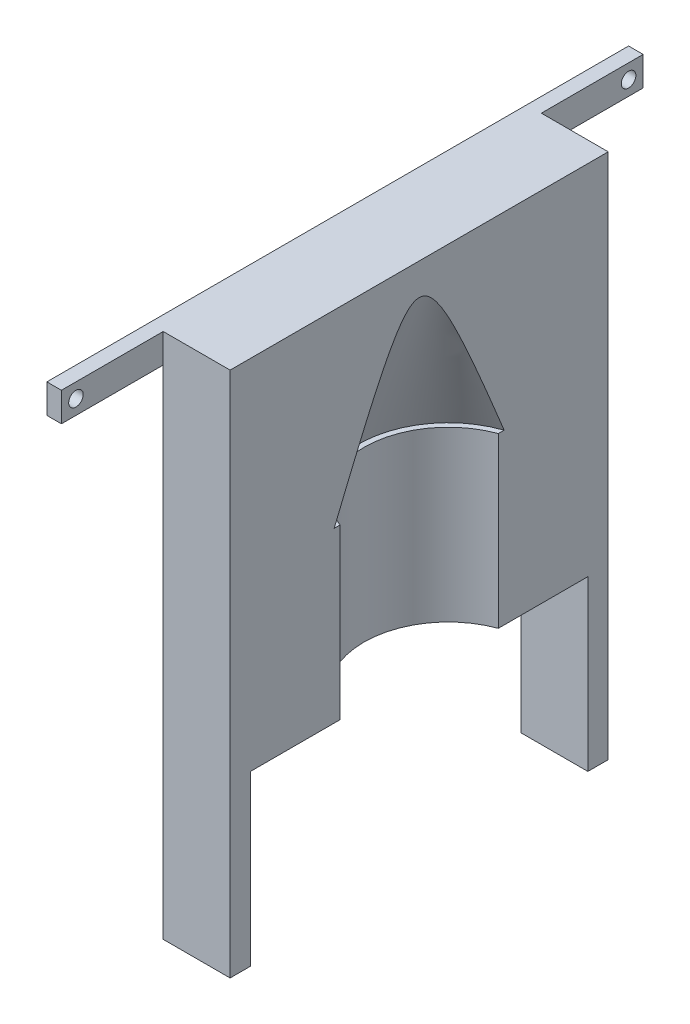
ISO-10303-21;
HEADER;
FILE_DESCRIPTION(('STEP AP214'),'2;1');
FILE_NAME('part.step','',(''),(''),'','','');
FILE_SCHEMA(('AUTOMOTIVE_DESIGN { 1 0 10303 214 1 1 1 1 }'));
ENDSEC;
DATA;
#1=APPLICATION_CONTEXT('core data for automotive mechanical design processes');
#2=APPLICATION_PROTOCOL_DEFINITION('international standard','automotive_design',2000,#1);
#3=PRODUCT_CONTEXT('',#1,'mechanical');
#4=PRODUCT('Part','Part','',(#3));
#5=PRODUCT_RELATED_PRODUCT_CATEGORY('part','',(#4));
#6=PRODUCT_DEFINITION_FORMATION('','',#4);
#7=PRODUCT_DEFINITION_CONTEXT('part definition',#1,'design');
#8=PRODUCT_DEFINITION('design','',#6,#7);
#9=PRODUCT_DEFINITION_SHAPE('','',#8);
#10=(LENGTH_UNIT() NAMED_UNIT(*) SI_UNIT(.MILLI.,.METRE.));
#11=(NAMED_UNIT(*) PLANE_ANGLE_UNIT() SI_UNIT($,.RADIAN.));
#12=(NAMED_UNIT(*) SI_UNIT($,.STERADIAN.) SOLID_ANGLE_UNIT());
#13=UNCERTAINTY_MEASURE_WITH_UNIT(LENGTH_MEASURE(1.E-05),#10,'distance_accuracy_value','');
#14=(GEOMETRIC_REPRESENTATION_CONTEXT(3) GLOBAL_UNCERTAINTY_ASSIGNED_CONTEXT((#13)) GLOBAL_UNIT_ASSIGNED_CONTEXT((#10,
#11,#12)) REPRESENTATION_CONTEXT('',''));
#15=CARTESIAN_POINT('',(0.,0.,0.));
#16=DIRECTION('',(0.,0.,1.));
#17=DIRECTION('',(1.,0.,0.));
#18=AXIS2_PLACEMENT_3D('',#15,#16,#17);
#19=CARTESIAN_POINT('',(0.,0.,0.));
#20=DIRECTION('',(-1.,0.,0.));
#21=DIRECTION('',(0.,0.,1.));
#22=AXIS2_PLACEMENT_3D('',#19,#20,#21);
#23=PLANE('',#22);
#24=DIRECTION('',(0.,-1.,0.));
#25=VECTOR('',#24,1.);
#26=CARTESIAN_POINT('',(0.,90.5,65.));
#27=LINE('',#26,#25);
#28=CARTESIAN_POINT('',(0.,80.5,65.));
#29=VERTEX_POINT('',#28);
#30=CARTESIAN_POINT('',(0.,-90.5,65.));
#31=VERTEX_POINT('',#30);
#32=EDGE_CURVE('E239',#29,#31,#27,.T.);
#33=ORIENTED_EDGE('',*,*,#32,.F.);
#34=DIRECTION('',(0.,0.,-1.));
#35=VECTOR('',#34,1.);
#36=CARTESIAN_POINT('',(0.,80.5,-100.));
#37=LINE('',#36,#35);
#38=CARTESIAN_POINT('',(0.,80.5,-65.));
#39=VERTEX_POINT('',#38);
#40=EDGE_CURVE('E11',#29,#39,#37,.T.);
#41=ORIENTED_EDGE('',*,*,#40,.T.);
#42=DIRECTION('',(0.,1.,0.));
#43=VECTOR('',#42,1.);
#44=CARTESIAN_POINT('',(0.,90.5,-65.));
#45=LINE('',#44,#43);
#46=CARTESIAN_POINT('',(0.,-90.5,-65.));
#47=VERTEX_POINT('',#46);
#48=EDGE_CURVE('E250',#47,#39,#45,.T.);
#49=ORIENTED_EDGE('',*,*,#48,.F.);
#50=DIRECTION('',(0.,0.,-1.));
#51=VECTOR('',#50,1.);
#52=CARTESIAN_POINT('',(0.,-90.5,-65.));
#53=LINE('',#52,#51);
#54=CARTESIAN_POINT('',(0.,-90.5,-58.));
#55=VERTEX_POINT('',#54);
#56=EDGE_CURVE('E268',#55,#47,#53,.T.);
#57=ORIENTED_EDGE('',*,*,#56,.F.);
#58=DIRECTION('',(0.,1.,0.));
#59=VECTOR('',#58,1.);
#60=CARTESIAN_POINT('',(0.,-32.5,-58.));
#61=LINE('',#60,#59);
#62=CARTESIAN_POINT('',(0.,-32.5,-58.));
#63=VERTEX_POINT('',#62);
#64=EDGE_CURVE('E221',#55,#63,#61,.T.);
#65=ORIENTED_EDGE('',*,*,#64,.T.);
#66=DIRECTION('',(0.,0.,1.));
#67=VECTOR('',#66,1.);
#68=CARTESIAN_POINT('',(0.,-32.5,-58.));
#69=LINE('',#68,#67);
#70=CARTESIAN_POINT('',(0.,-32.5,58.));
#71=VERTEX_POINT('',#70);
#72=EDGE_CURVE('E225',#63,#71,#69,.T.);
#73=ORIENTED_EDGE('',*,*,#72,.T.);
#74=DIRECTION('',(0.,-1.,0.));
#75=VECTOR('',#74,1.);
#76=CARTESIAN_POINT('',(0.,-32.5,58.));
#77=LINE('',#76,#75);
#78=CARTESIAN_POINT('',(0.,-90.5,58.));
#79=VERTEX_POINT('',#78);
#80=EDGE_CURVE('E218',#71,#79,#77,.T.);
#81=ORIENTED_EDGE('',*,*,#80,.T.);
#82=EDGE_CURVE('E262',#31,#79,#53,.T.);
#83=ORIENTED_EDGE('',*,*,#82,.F.);
#84=EDGE_LOOP('',(#33,#41,#49,#57,#65,#73,#81,#83));
#85=FACE_BOUND('',#84,.T.);
#86=ADVANCED_FACE('F33',(#85),#23,.T.);
#87=CARTESIAN_POINT('',(23.,0.,0.));
#88=DIRECTION('',(-1.,0.,0.));
#89=DIRECTION('',(0.,0.,1.));
#90=AXIS2_PLACEMENT_3D('',#87,#88,#89);
#91=PLANE('',#90);
#92=DIRECTION('',(0.,0.,-1.));
#93=VECTOR('',#92,1.);
#94=CARTESIAN_POINT('',(23.,25.5,0.));
#95=LINE('',#94,#93);
#96=CARTESIAN_POINT('',(23.,25.5,29.2193360843119));
#97=VERTEX_POINT('',#96);
#98=CARTESIAN_POINT('',(23.,25.5,27.2213151776324));
#99=VERTEX_POINT('',#98);
#100=EDGE_CURVE('E206',#97,#99,#95,.T.);
#101=ORIENTED_EDGE('',*,*,#100,.F.);
#102=CARTESIAN_POINT('',(23.,-2.71694901188246,-40.561504425211));
#103=CARTESIAN_POINT('',(23.,-1.15456543043743,-39.9402937218127));
#104=CARTESIAN_POINT('',(23.,0.407543859413401,-39.3183923668862));
#105=CARTESIAN_POINT('',(23.,3.53111515281802,-38.0729612876549));
#106=CARTESIAN_POINT('',(23.,5.09257715564489,-37.4494315615272));
#107=CARTESIAN_POINT('',(23.,8.21531728527836,-36.2002718070121));
#108=CARTESIAN_POINT('',(23.,9.77659514048049,-35.574641099497));
#109=CARTESIAN_POINT('',(23.,12.8982700185201,-34.3211883229983));
#110=CARTESIAN_POINT('',(23.,14.4586670418974,-33.6933662553592));
#111=CARTESIAN_POINT('',(23.,17.5698409111622,-32.4386023596454));
#112=CARTESIAN_POINT('',(23.,19.1206234633394,-31.8116746840084));
#113=CARTESIAN_POINT('',(23.,22.220959269952,-30.5547873347075));
#114=CARTESIAN_POINT('',(23.,23.7705125247416,-29.9248276619174));
#115=CARTESIAN_POINT('',(23.,26.8676055656516,-28.6614806305581));
#116=CARTESIAN_POINT('',(23.,28.4151458581239,-28.0280945138507));
#117=CARTESIAN_POINT('',(23.,31.508398754766,-26.7568947926566));
#118=CARTESIAN_POINT('',(23.,33.0541113681163,-26.1190812105204));
#119=CARTESIAN_POINT('',(23.,36.1426066265848,-24.8382570011151));
#120=CARTESIAN_POINT('',(23.,37.6853902441934,-24.1952487207926));
#121=CARTESIAN_POINT('',(23.,40.768106302081,-22.9023449721368));
#122=CARTESIAN_POINT('',(23.,42.3080386862585,-22.2524493699435));
#123=CARTESIAN_POINT('',(23.,45.385754569798,-20.943170700217));
#124=CARTESIAN_POINT('',(23.,46.9235341984788,-20.2837785139636));
#125=CARTESIAN_POINT('',(23.,49.2263621039367,-19.2859586068128));
#126=CARTESIAN_POINT('',(23.,49.9933069999857,-18.9519073825875));
#127=CARTESIAN_POINT('',(23.,51.5257034264248,-18.2803985921166));
#128=CARTESIAN_POINT('',(23.,52.2911549597671,-17.9429410326128));
#129=CARTESIAN_POINT('',(23.,53.8269946178615,-17.2610600098653));
#130=CARTESIAN_POINT('',(23.,54.5973671555537,-16.9166014095153));
#131=CARTESIAN_POINT('',(23.,56.135939904365,-16.2228684793397));
#132=CARTESIAN_POINT('',(23.,56.904140121607,-15.8735941631041));
#133=CARTESIAN_POINT('',(23.,58.4381041640188,-15.1691669180396));
#134=CARTESIAN_POINT('',(23.,59.2038672531584,-14.814012383253));
#135=CARTESIAN_POINT('',(23.,60.3500204827291,-14.2759929366525));
#136=CARTESIAN_POINT('',(23.,60.7316529530101,-14.0957734681745));
#137=CARTESIAN_POINT('',(23.,61.4939889403606,-13.7333651622926));
#138=CARTESIAN_POINT('',(23.,61.8746924428335,-13.5511762941848));
#139=CARTESIAN_POINT('',(23.,63.0135781579353,-13.0021254362194));
#140=CARTESIAN_POINT('',(23.,63.7701934368655,-12.6320032769823));
#141=CARTESIAN_POINT('',(23.,65.2779645582308,-11.8808002120246));
#142=CARTESIAN_POINT('',(23.,66.0291205398604,-11.4997195869459));
#143=CARTESIAN_POINT('',(23.,67.1501444488687,-10.9174956283988));
#144=CARTESIAN_POINT('',(23.,67.5227889825381,-10.7216964538518));
#145=CARTESIAN_POINT('',(23.,68.2658834930811,-10.3259810709359));
#146=CARTESIAN_POINT('',(23.,68.6363334972693,-10.1260649139492));
#147=CARTESIAN_POINT('',(23.,69.3745745748583,-9.72147651651361));
#148=CARTESIAN_POINT('',(23.,69.7423659540936,-9.51680483490947));
#149=CARTESIAN_POINT('',(23.,70.4747693145419,-9.10185915092699));
#150=CARTESIAN_POINT('',(23.,70.8393813830092,-8.89158530294295));
#151=CARTESIAN_POINT('',(23.,71.5119297087436,-8.4954550213924));
#152=CARTESIAN_POINT('',(23.,71.820394256708,-8.31049674268002));
#153=CARTESIAN_POINT('',(23.,72.433863826224,-7.93487717515019));
#154=CARTESIAN_POINT('',(23.,72.7388686528803,-7.74421556722791));
#155=CARTESIAN_POINT('',(23.,73.3452774902472,-7.35571218094492));
#156=CARTESIAN_POINT('',(23.,73.6466715651584,-7.15785484587998));
#157=CARTESIAN_POINT('',(23.,74.2439766870462,-6.75405717795531));
#158=CARTESIAN_POINT('',(23.,74.5398882297634,-6.5481175812113));
#159=CARTESIAN_POINT('',(23.,75.1205220332889,-6.12938054734126));
#160=CARTESIAN_POINT('',(23.,75.4053433443837,-5.91672124780829));
#161=CARTESIAN_POINT('',(23.,75.9659883264871,-5.47956579872521));
#162=CARTESIAN_POINT('',(23.,76.2418082336515,-5.25506479779258));
#163=CARTESIAN_POINT('',(23.,76.780034424738,-4.79220456885678));
#164=CARTESIAN_POINT('',(23.,77.0424854609127,-4.55389819124395));
#165=CARTESIAN_POINT('',(23.,77.4226573448818,-4.18281389138397));
#166=CARTESIAN_POINT('',(23.,77.547084608895,-4.05690011927531));
#167=CARTESIAN_POINT('',(23.,77.7904865498645,-3.79992477227676));
#168=CARTESIAN_POINT('',(23.,77.9094623374794,-3.66886425615597));
#169=CARTESIAN_POINT('',(23.,78.1224575209398,-3.42214829403843));
#170=CARTESIAN_POINT('',(23.,78.2174483985736,-3.30733376075375));
#171=CARTESIAN_POINT('',(23.,78.4017799637868,-3.0732107641221));
#172=CARTESIAN_POINT('',(23.,78.4911197726235,-2.95390160643978));
#173=CARTESIAN_POINT('',(23.,78.6631506456405,-2.71018350603859));
#174=CARTESIAN_POINT('',(23.,78.7458285771006,-2.58576518647259));
#175=CARTESIAN_POINT('',(23.,78.9028876860373,-2.33185528044668));
#176=CARTESIAN_POINT('',(23.,78.9772686440286,-2.20236355989915));
#177=CARTESIAN_POINT('',(23.,79.1877926361966,-1.80133618075302));
#178=CARTESIAN_POINT('',(23.,79.3085048497714,-1.52105716625192));
#179=CARTESIAN_POINT('',(23.,79.4458425888297,-1.08748685088425));
#180=CARTESIAN_POINT('',(23.,79.4843116637673,-0.940970508247966));
#181=CARTESIAN_POINT('',(23.,79.5449735118343,-0.644557975912634));
#182=CARTESIAN_POINT('',(23.,79.5671715254719,-0.494662890469897));
#183=CARTESIAN_POINT('',(23.,79.5921967927631,-0.213742779196021));
#184=CARTESIAN_POINT('',(23.,79.5972405295485,-0.0829118420919518));
#185=CARTESIAN_POINT('',(23.,79.5939977081466,0.178577569550754));
#186=CARTESIAN_POINT('',(23.,79.5857125168273,0.309236060398441));
#187=CARTESIAN_POINT('',(23.,79.5561648836452,0.569247369845229));
#188=CARTESIAN_POINT('',(23.,79.5348840023799,0.698598067251521));
#189=CARTESIAN_POINT('',(23.,79.4802309457021,0.954710031569805));
#190=CARTESIAN_POINT('',(23.,79.4468566760409,1.08147084596501));
#191=CARTESIAN_POINT('',(23.,79.3627813091392,1.35242704328258));
#192=CARTESIAN_POINT('',(23.,79.310120643362,1.4960117386883));
#193=CARTESIAN_POINT('',(23.,79.1921628754834,1.77790944926006));
#194=CARTESIAN_POINT('',(23.,79.1268591703966,1.91621966438529));
#195=CARTESIAN_POINT('',(23.,78.9856329108635,2.1874748901642));
#196=CARTESIAN_POINT('',(23.,78.909697479114,2.32041313877253));
#197=CARTESIAN_POINT('',(23.,78.7491112817668,2.58086427365188));
#198=CARTESIAN_POINT('',(23.,78.6644608542734,2.7083773701244));
#199=CARTESIAN_POINT('',(23.,78.4702495234878,2.98340804025333));
#200=CARTESIAN_POINT('',(23.,78.3591002026795,3.12979956968401));
#201=CARTESIAN_POINT('',(23.,78.1285338962478,3.41595136498936));
#202=CARTESIAN_POINT('',(23.,78.0091138688855,3.55570915896887));
#203=CARTESIAN_POINT('',(23.,77.7634843786121,3.82945482650925));
#204=CARTESIAN_POINT('',(23.,77.6372654762113,3.96343418740295));
#205=CARTESIAN_POINT('',(23.,77.3794300652796,4.22610068254962));
#206=CARTESIAN_POINT('',(23.,77.2478129192007,4.35478718808593));
#207=CARTESIAN_POINT('',(23.,76.9792580973167,4.60830766795903));
#208=CARTESIAN_POINT('',(23.,76.8422906344568,4.73310997859284));
#209=CARTESIAN_POINT('',(23.,76.564633297248,4.97849644747564));
#210=CARTESIAN_POINT('',(23.,76.4239433331556,5.09908050386639));
#211=CARTESIAN_POINT('',(23.,76.1395812101376,5.3363840920327));
#212=CARTESIAN_POINT('',(23.,75.9959120988749,5.45310728408698));
#213=CARTESIAN_POINT('',(23.,75.7059353166831,5.68320925032487));
#214=CARTESIAN_POINT('',(23.,75.5596277315765,5.79658813297491));
#215=CARTESIAN_POINT('',(23.,75.093758766028,6.15014694199077));
#216=CARTESIAN_POINT('',(23.,74.7700588568905,6.38488265091182));
#217=CARTESIAN_POINT('',(23.,74.11491298213,6.84332497142497));
#218=CARTESIAN_POINT('',(23.,73.7834654559411,7.06702933231018));
#219=CARTESIAN_POINT('',(23.,73.1144718529395,7.50558138067126));
#220=CARTESIAN_POINT('',(23.,72.7769219580433,7.72042322637696));
#221=CARTESIAN_POINT('',(23.,72.0972028064485,8.14267705532417));
#222=CARTESIAN_POINT('',(23.,71.755033349213,8.35008871458142));
#223=CARTESIAN_POINT('',(23.,71.0661118373121,8.75921468245548));
#224=CARTESIAN_POINT('',(23.,70.7193501936873,8.96091280660218));
#225=CARTESIAN_POINT('',(23.,70.0227967989378,9.35900885811934));
#226=CARTESIAN_POINT('',(23.,69.6730050009725,9.55540670336355));
#227=CARTESIAN_POINT('',(23.,68.9710522926589,9.94358616791139));
#228=CARTESIAN_POINT('',(23.,68.6188923661135,10.1353695688927));
#229=CARTESIAN_POINT('',(23.,67.9124615820975,10.5150121798831));
#230=CARTESIAN_POINT('',(23.,67.5581906986712,10.7028713415123));
#231=CARTESIAN_POINT('',(23.,66.4903682781551,11.2625631181371));
#232=CARTESIAN_POINT('',(23.,65.7741147213141,11.6292433523326));
#233=CARTESIAN_POINT('',(23.,64.3362311546349,12.352013494134));
#234=CARTESIAN_POINT('',(23.,63.614600679623,12.7081024718368));
#235=CARTESIAN_POINT('',(23.,62.1684374349543,13.4112409544957));
#236=CARTESIAN_POINT('',(23.,61.4439114849179,13.7583045034329));
#237=CARTESIAN_POINT('',(23.,60.3547134084548,14.2737618720948));
#238=CARTESIAN_POINT('',(23.,59.9912517112387,14.4447219662279));
#239=CARTESIAN_POINT('',(23.,59.2636005381594,14.7850865326695));
#240=CARTESIAN_POINT('',(23.,58.8994110624308,14.9544910052656));
#241=CARTESIAN_POINT('',(23.,57.8002160542382,15.4632031785868));
#242=CARTESIAN_POINT('',(23.,57.0642110358358,15.8003521368482));
#243=CARTESIAN_POINT('',(23.,55.5900310787856,16.4698761374476));
#244=CARTESIAN_POINT('',(23.,54.8518561274632,16.8022511518339));
#245=CARTESIAN_POINT('',(23.,53.3736888949931,17.4629733678655));
#246=CARTESIAN_POINT('',(23.,52.6336965772592,17.7913204876122));
#247=CARTESIAN_POINT('',(23.,51.1521914817615,18.4445680789479));
#248=CARTESIAN_POINT('',(23.,50.4106787004866,18.769468542567));
#249=CARTESIAN_POINT('',(23.,48.184084417211,19.739794340674));
#250=CARTESIAN_POINT('',(23.,46.6970715664036,20.3807886030345));
#251=CARTESIAN_POINT('',(23.,43.7192227414358,21.6538329113044));
#252=CARTESIAN_POINT('',(23.,42.2283867495994,22.2858829157726));
#253=CARTESIAN_POINT('',(23.,39.2421760433701,23.5436709468871));
#254=CARTESIAN_POINT('',(23.,37.746798177676,24.1694014862567));
#255=CARTESIAN_POINT('',(23.,34.7537225760922,25.4152946043202));
#256=CARTESIAN_POINT('',(23.,33.2560248346804,26.0354571697367));
#257=CARTESIAN_POINT('',(23.,30.2588501541198,27.2712392321964));
#258=CARTESIAN_POINT('',(23.,28.7593733135554,27.886858968465));
#259=CARTESIAN_POINT('',(23.,25.7589009331061,29.1143861179093));
#260=CARTESIAN_POINT('',(23.,24.2579053925725,29.7262935294989));
#261=CARTESIAN_POINT('',(23.,19.878421301271,31.5064464282132));
#262=CARTESIAN_POINT('',(23.,16.9982641846121,32.6705867403951));
#263=CARTESIAN_POINT('',(23.,11.2346237981118,34.9907314231739));
#264=CARTESIAN_POINT('',(23.,8.35114047415496,36.1467356591653));
#265=CARTESIAN_POINT('',(23.,2.58591599912343,38.4509365540143));
#266=CARTESIAN_POINT('',(23.,-0.295821594070801,39.5991421178015));
#267=CARTESIAN_POINT('',(23.,-4.6198033794067,41.3179037899596));
#268=CARTESIAN_POINT('',(23.,-6.06134546107743,41.8902275333845));
#269=CARTESIAN_POINT('',(23.,-8.94484592524028,43.0338243070685));
#270=CARTESIAN_POINT('',(23.,-10.386804307625,43.6050973375986));
#271=CARTESIAN_POINT('',(23.,-11.828945338117,44.1759089828929));
#272=B_SPLINE_CURVE_WITH_KNOTS('',3,(#102,#103,#104,#105,#106,#107,#108,#109,#110,#111,#112,
#113,#114,#115,#116,#117,#118,#119,#120,#121,#122,#123,#124,#125,#126,#127,#128,#129,#130,#131,
#132,#133,#134,#135,#136,#137,#138,#139,#140,#141,#142,#143,#144,#145,#146,#147,#148,#149,#150,
#151,#152,#153,#154,#155,#156,#157,#158,#159,#160,#161,#162,#163,#164,#165,#166,#167,#168,#169,
#170,#171,#172,#173,#174,#175,#176,#177,#178,#179,#180,#181,#182,#183,#184,#185,#186,#187,#188,
#189,#190,#191,#192,#193,#194,#195,#196,#197,#198,#199,#200,#201,#202,#203,#204,#205,#206,#207,
#208,#209,#210,#211,#212,#213,#214,#215,#216,#217,#218,#219,#220,#221,#222,#223,#224,#225,#226,
#227,#228,#229,#230,#231,#232,#233,#234,#235,#236,#237,#238,#239,#240,#241,#242,#243,#244,#245,
#246,#247,#248,#249,#250,#251,#252,#253,#254,#255,#256,#257,#258,#259,#260,#261,#262,#263,#264,
#265,#266,#267,#268,#269,#270,#271),.UNSPECIFIED.,.F.,.F.,(4,2,2,2,2,2,2,2,2,2,2,2,2,2,2,2,2,2,
2,2,2,2,2,2,2,2,2,2,2,2,2,2,2,2,2,2,2,2,2,2,2,2,2,2,2,2,2,2,2,2,2,2,2,2,2,2,2,2,2,2,2,2,2,2,2,2,
2,2,2,2,2,2,2,2,2,2,2,2,2,2,2,2,2,2,4),(0.,5.04405684692274,10.0881193431666,15.1340094055082,
20.1798963723327,25.1980291707885,30.2161605230357,35.2325809935415,40.2489761588142,
45.2632192639707,50.2775600038071,55.2970877399957,57.8066931717568,60.3162936373109,
62.8479056250019,65.379510469982,67.9118185207003,69.1779500971437,70.4441014417133,
72.9709130903674,75.4976600858972,76.760498052086,78.0233202669018,79.2859948244892,
80.5486346190047,81.6275830318934,82.7065919259531,83.788091258061,84.8694923169988,
85.935603025872,87.0021539503866,88.0648617601586,88.5958014984695,89.1266325801888,
89.573528733341,90.0204942089839,90.4683202738568,90.9161581825582,91.8259293632244,
92.2796363323282,92.7331971093017,93.1253239603836,93.5174106018207,93.9100548663008,
94.3027671586984,94.7608573005813,95.21918733431,95.6780773853861,96.1369496402095,
96.6879859909497,97.2392260850541,97.791252298161,98.3433438959374,98.8991419304518,
99.4549533765794,100.010221834878,100.565472264234,101.764694178034,102.964159763165,
104.164403744372,105.364699997216,106.568111573436,107.771541785469,108.974499633543,
110.17747230354,112.591313739925,115.005366487594,117.415405855909,118.620386856741,
119.825367634815,122.253997813207,124.682642205627,127.111335897765,129.540035204759,
134.397842959735,139.255673214846,144.118707575646,148.981753529729,153.844541541615,
158.707331631045,168.02690131841,177.346624830594,186.65280450768,191.305801349152,
195.958796990949),.UNSPECIFIED.);
#273=CARTESIAN_POINT('',(23.,25.5,-29.2193360843119));
#274=VERTEX_POINT('',#273);
#275=EDGE_CURVE('E42',#274,#97,#272,.T.);
#276=ORIENTED_EDGE('',*,*,#275,.F.);
#277=CARTESIAN_POINT('',(23.,25.5,-27.2213151776324));
#278=VERTEX_POINT('',#277);
#279=EDGE_CURVE('E202',#278,#274,#95,.T.);
#280=ORIENTED_EDGE('',*,*,#279,.F.);
#281=DIRECTION('',(0.,-1.,0.));
#282=VECTOR('',#281,1.);
#283=CARTESIAN_POINT('',(23.,25.5,-27.2213151776324));
#284=LINE('',#283,#282);
#285=CARTESIAN_POINT('',(23.,-32.5,-27.2213151776324));
#286=VERTEX_POINT('',#285);
#287=EDGE_CURVE('E214',#278,#286,#284,.T.);
#288=ORIENTED_EDGE('',*,*,#287,.T.);
#289=DIRECTION('',(0.,0.,1.));
#290=VECTOR('',#289,1.);
#291=CARTESIAN_POINT('',(23.,-32.5,-58.));
#292=LINE('',#291,#290);
#293=CARTESIAN_POINT('',(23.,-32.5,-58.));
#294=VERTEX_POINT('',#293);
#295=EDGE_CURVE('E222',#294,#286,#292,.T.);
#296=ORIENTED_EDGE('',*,*,#295,.F.);
#297=DIRECTION('',(0.,1.,0.));
#298=VECTOR('',#297,1.);
#299=CARTESIAN_POINT('',(23.,-32.5,-58.));
#300=LINE('',#299,#298);
#301=CARTESIAN_POINT('',(23.,-90.5,-58.));
#302=VERTEX_POINT('',#301);
#303=EDGE_CURVE('E230',#302,#294,#300,.T.);
#304=ORIENTED_EDGE('',*,*,#303,.F.);
#305=DIRECTION('',(0.,0.,-1.));
#306=VECTOR('',#305,1.);
#307=CARTESIAN_POINT('',(23.,-90.5,-65.));
#308=LINE('',#307,#306);
#309=CARTESIAN_POINT('',(23.,-90.5,-65.));
#310=VERTEX_POINT('',#309);
#311=EDGE_CURVE('E249',#302,#310,#308,.T.);
#312=ORIENTED_EDGE('',*,*,#311,.T.);
#313=DIRECTION('',(0.,1.,0.));
#314=VECTOR('',#313,1.);
#315=CARTESIAN_POINT('',(23.,90.5,-65.));
#316=LINE('',#315,#314);
#317=CARTESIAN_POINT('',(23.,90.5,-65.));
#318=VERTEX_POINT('',#317);
#319=EDGE_CURVE('E254',#310,#318,#316,.T.);
#320=ORIENTED_EDGE('',*,*,#319,.T.);
#321=DIRECTION('',(0.,0.,1.));
#322=VECTOR('',#321,1.);
#323=CARTESIAN_POINT('',(23.,90.5,-65.));
#324=LINE('',#323,#322);
#325=CARTESIAN_POINT('',(23.,90.5,65.));
#326=VERTEX_POINT('',#325);
#327=EDGE_CURVE('E256',#318,#326,#324,.T.);
#328=ORIENTED_EDGE('',*,*,#327,.T.);
#329=DIRECTION('',(0.,-1.,0.));
#330=VECTOR('',#329,1.);
#331=CARTESIAN_POINT('',(23.,90.5,65.));
#332=LINE('',#331,#330);
#333=CARTESIAN_POINT('',(23.,-90.5,65.));
#334=VERTEX_POINT('',#333);
#335=EDGE_CURVE('E246',#326,#334,#332,.T.);
#336=ORIENTED_EDGE('',*,*,#335,.T.);
#337=CARTESIAN_POINT('',(23.,-90.5,58.));
#338=VERTEX_POINT('',#337);
#339=EDGE_CURVE('E251',#334,#338,#308,.T.);
#340=ORIENTED_EDGE('',*,*,#339,.T.);
#341=DIRECTION('',(0.,-1.,0.));
#342=VECTOR('',#341,1.);
#343=CARTESIAN_POINT('',(23.,-32.5,58.));
#344=LINE('',#343,#342);
#345=CARTESIAN_POINT('',(23.,-32.5,58.));
#346=VERTEX_POINT('',#345);
#347=EDGE_CURVE('E217',#346,#338,#344,.T.);
#348=ORIENTED_EDGE('',*,*,#347,.F.);
#349=CARTESIAN_POINT('',(23.,-32.5,27.2213151776324));
#350=VERTEX_POINT('',#349);
#351=EDGE_CURVE('E233',#350,#346,#292,.T.);
#352=ORIENTED_EDGE('',*,*,#351,.F.);
#353=DIRECTION('',(0.,-1.,0.));
#354=VECTOR('',#353,1.);
#355=CARTESIAN_POINT('',(23.,25.5,27.2213151776324));
#356=LINE('',#355,#354);
#357=EDGE_CURVE('E59',#350,#99,#356,.F.);
#358=ORIENTED_EDGE('',*,*,#357,.T.);
#359=EDGE_LOOP('',(#101,#276,#280,#288,#296,#304,#312,#320,#328,#336,#340,#348,#352,#358));
#360=FACE_BOUND('',#359,.T.);
#361=ADVANCED_FACE('F297',(#360),#91,.F.);
#362=CARTESIAN_POINT('',(23.,-90.5,-65.));
#363=DIRECTION('',(0.,1.,0.));
#364=DIRECTION('',(0.,0.,1.));
#365=AXIS2_PLACEMENT_3D('',#362,#363,#364);
#366=PLANE('',#365);
#367=ORIENTED_EDGE('',*,*,#82,.T.);
#368=DIRECTION('',(1.,0.,0.));
#369=VECTOR('',#368,1.);
#370=CARTESIAN_POINT('',(0.,-90.5,58.));
#371=LINE('',#370,#369);
#372=EDGE_CURVE('E228',#79,#338,#371,.T.);
#373=ORIENTED_EDGE('',*,*,#372,.T.);
#374=ORIENTED_EDGE('',*,*,#339,.F.);
#375=DIRECTION('',(-1.,0.,0.));
#376=VECTOR('',#375,1.);
#377=CARTESIAN_POINT('',(23.,-90.5,65.));
#378=LINE('',#377,#376);
#379=EDGE_CURVE('E287',#334,#31,#378,.T.);
#380=ORIENTED_EDGE('',*,*,#379,.T.);
#381=EDGE_LOOP('',(#367,#373,#374,#380));
#382=FACE_BOUND('',#381,.T.);
#383=ADVANCED_FACE('F332',(#382),#366,.F.);
#384=CARTESIAN_POINT('',(23.,90.5,65.));
#385=DIRECTION('',(0.,0.,-1.));
#386=DIRECTION('',(0.,1.,0.));
#387=AXIS2_PLACEMENT_3D('',#384,#385,#386);
#388=PLANE('',#387);
#389=CARTESIAN_POINT('',(0.,90.5,65.));
#390=VERTEX_POINT('',#389);
#391=EDGE_CURVE('E261',#390,#29,#27,.T.);
#392=ORIENTED_EDGE('',*,*,#391,.T.);
#393=ORIENTED_EDGE('',*,*,#32,.T.);
#394=ORIENTED_EDGE('',*,*,#379,.F.);
#395=ORIENTED_EDGE('',*,*,#335,.F.);
#396=DIRECTION('',(-1.,0.,0.));
#397=VECTOR('',#396,1.);
#398=CARTESIAN_POINT('',(23.,90.5,65.));
#399=LINE('',#398,#397);
#400=EDGE_CURVE('E258',#326,#390,#399,.T.);
#401=ORIENTED_EDGE('',*,*,#400,.T.);
#402=EDGE_LOOP('',(#392,#393,#394,#395,#401));
#403=FACE_BOUND('',#402,.T.);
#404=ADVANCED_FACE('F35',(#403),#388,.F.);
#405=ORIENTED_EDGE('',*,*,#311,.F.);
#406=DIRECTION('',(1.,0.,0.));
#407=VECTOR('',#406,1.);
#408=CARTESIAN_POINT('',(0.,-90.5,-58.));
#409=LINE('',#408,#407);
#410=EDGE_CURVE('E242',#55,#302,#409,.T.);
#411=ORIENTED_EDGE('',*,*,#410,.F.);
#412=ORIENTED_EDGE('',*,*,#56,.T.);
#413=DIRECTION('',(-1.,0.,0.));
#414=VECTOR('',#413,1.);
#415=CARTESIAN_POINT('',(23.,-90.5,-65.));
#416=LINE('',#415,#414);
#417=EDGE_CURVE('E285',#310,#47,#416,.T.);
#418=ORIENTED_EDGE('',*,*,#417,.F.);
#419=EDGE_LOOP('',(#405,#411,#412,#418));
#420=FACE_BOUND('',#419,.T.);
#421=ADVANCED_FACE('F313',(#420),#366,.F.);
#422=CARTESIAN_POINT('',(23.,90.5,-65.));
#423=DIRECTION('',(0.,0.,1.));
#424=DIRECTION('',(0.,-1.,0.));
#425=AXIS2_PLACEMENT_3D('',#422,#423,#424);
#426=PLANE('',#425);
#427=ORIENTED_EDGE('',*,*,#48,.T.);
#428=CARTESIAN_POINT('',(0.,90.5,-65.));
#429=VERTEX_POINT('',#428);
#430=EDGE_CURVE('E280',#39,#429,#45,.T.);
#431=ORIENTED_EDGE('',*,*,#430,.T.);
#432=DIRECTION('',(-1.,0.,0.));
#433=VECTOR('',#432,1.);
#434=CARTESIAN_POINT('',(23.,90.5,-65.));
#435=LINE('',#434,#433);
#436=EDGE_CURVE('E277',#318,#429,#435,.T.);
#437=ORIENTED_EDGE('',*,*,#436,.F.);
#438=ORIENTED_EDGE('',*,*,#319,.F.);
#439=ORIENTED_EDGE('',*,*,#417,.T.);
#440=EDGE_LOOP('',(#427,#431,#437,#438,#439));
#441=FACE_BOUND('',#440,.T.);
#442=ADVANCED_FACE('F319',(#441),#426,.F.);
#443=CARTESIAN_POINT('',(23.,90.5,-65.));
#444=DIRECTION('',(0.,-1.,0.));
#445=DIRECTION('',(0.,0.,-1.));
#446=AXIS2_PLACEMENT_3D('',#443,#444,#445);
#447=PLANE('',#446);
#448=ORIENTED_EDGE('',*,*,#436,.T.);
#449=DIRECTION('',(0.,0.,-1.));
#450=VECTOR('',#449,1.);
#451=CARTESIAN_POINT('',(0.,90.5,-100.));
#452=LINE('',#451,#450);
#453=CARTESIAN_POINT('',(0.,90.5,-100.));
#454=VERTEX_POINT('',#453);
#455=EDGE_CURVE('E186',#429,#454,#452,.T.);
#456=ORIENTED_EDGE('',*,*,#455,.T.);
#457=DIRECTION('',(-1.,0.,0.));
#458=VECTOR('',#457,1.);
#459=CARTESIAN_POINT('',(-5.,90.5,-100.));
#460=LINE('',#459,#458);
#461=CARTESIAN_POINT('',(-5.,90.5,-100.));
#462=VERTEX_POINT('',#461);
#463=EDGE_CURVE('E172',#454,#462,#460,.T.);
#464=ORIENTED_EDGE('',*,*,#463,.T.);
#465=DIRECTION('',(0.,0.,1.));
#466=VECTOR('',#465,1.);
#467=CARTESIAN_POINT('',(-5.,90.5,-100.));
#468=LINE('',#467,#466);
#469=CARTESIAN_POINT('',(-5.,90.5,100.));
#470=VERTEX_POINT('',#469);
#471=EDGE_CURVE('E182',#462,#470,#468,.T.);
#472=ORIENTED_EDGE('',*,*,#471,.T.);
#473=DIRECTION('',(1.,0.,0.));
#474=VECTOR('',#473,1.);
#475=CARTESIAN_POINT('',(-5.,90.5,100.));
#476=LINE('',#475,#474);
#477=CARTESIAN_POINT('',(0.,90.5,100.));
#478=VERTEX_POINT('',#477);
#479=EDGE_CURVE('E155',#470,#478,#476,.T.);
#480=ORIENTED_EDGE('',*,*,#479,.T.);
#481=EDGE_CURVE('E175',#478,#390,#452,.T.);
#482=ORIENTED_EDGE('',*,*,#481,.T.);
#483=ORIENTED_EDGE('',*,*,#400,.F.);
#484=ORIENTED_EDGE('',*,*,#327,.F.);
#485=EDGE_LOOP('',(#448,#456,#464,#472,#480,#482,#483,#484));
#486=FACE_BOUND('',#485,.T.);
#487=ADVANCED_FACE('F325',(#486),#447,.F.);
#488=CARTESIAN_POINT('',(0.,-32.5,58.));
#489=DIRECTION('',(0.,0.,1.));
#490=DIRECTION('',(1.,0.,0.));
#491=AXIS2_PLACEMENT_3D('',#488,#489,#490);
#492=PLANE('',#491);
#493=ORIENTED_EDGE('',*,*,#347,.T.);
#494=ORIENTED_EDGE('',*,*,#372,.F.);
#495=ORIENTED_EDGE('',*,*,#80,.F.);
#496=DIRECTION('',(1.,0.,0.));
#497=VECTOR('',#496,1.);
#498=CARTESIAN_POINT('',(0.,-32.5,58.));
#499=LINE('',#498,#497);
#500=EDGE_CURVE('E236',#71,#346,#499,.T.);
#501=ORIENTED_EDGE('',*,*,#500,.T.);
#502=EDGE_LOOP('',(#493,#494,#495,#501));
#503=FACE_BOUND('',#502,.T.);
#504=ADVANCED_FACE('F335',(#503),#492,.F.);
#505=CARTESIAN_POINT('',(0.,-32.5,-58.));
#506=DIRECTION('',(0.,1.,0.));
#507=DIRECTION('',(0.,0.,1.));
#508=AXIS2_PLACEMENT_3D('',#505,#506,#507);
#509=PLANE('',#508);
#510=ORIENTED_EDGE('',*,*,#295,.T.);
#511=CARTESIAN_POINT('',(33.,-32.5,0.));
#512=DIRECTION('',(0.,-1.,0.));
#513=DIRECTION('',(0.,0.,-1.));
#514=AXIS2_PLACEMENT_3D('',#511,#512,#513);
#515=CIRCLE('',#514,29.);
#516=EDGE_CURVE('E211',#350,#286,#515,.T.);
#517=ORIENTED_EDGE('',*,*,#516,.F.);
#518=ORIENTED_EDGE('',*,*,#351,.T.);
#519=ORIENTED_EDGE('',*,*,#500,.F.);
#520=ORIENTED_EDGE('',*,*,#72,.F.);
#521=DIRECTION('',(1.,0.,0.));
#522=VECTOR('',#521,1.);
#523=CARTESIAN_POINT('',(0.,-32.5,-58.));
#524=LINE('',#523,#522);
#525=EDGE_CURVE('E240',#63,#294,#524,.T.);
#526=ORIENTED_EDGE('',*,*,#525,.T.);
#527=EDGE_LOOP('',(#510,#517,#518,#519,#520,#526));
#528=FACE_BOUND('',#527,.T.);
#529=ADVANCED_FACE('F305',(#528),#509,.F.);
#530=CARTESIAN_POINT('',(0.,-32.5,-58.));
#531=DIRECTION('',(0.,0.,-1.));
#532=DIRECTION('',(-1.,0.,0.));
#533=AXIS2_PLACEMENT_3D('',#530,#531,#532);
#534=PLANE('',#533);
#535=ORIENTED_EDGE('',*,*,#303,.T.);
#536=ORIENTED_EDGE('',*,*,#525,.F.);
#537=ORIENTED_EDGE('',*,*,#64,.F.);
#538=ORIENTED_EDGE('',*,*,#410,.T.);
#539=EDGE_LOOP('',(#535,#536,#537,#538));
#540=FACE_BOUND('',#539,.T.);
#541=ADVANCED_FACE('F308',(#540),#534,.F.);
#542=CARTESIAN_POINT('',(33.,25.5,0.));
#543=DIRECTION('',(0.,-1.,0.));
#544=DIRECTION('',(0.,0.,-1.));
#545=AXIS2_PLACEMENT_3D('',#542,#543,#544);
#546=CYLINDRICAL_SURFACE('',#545,29.);
#547=CARTESIAN_POINT('',(33.,25.5,0.));
#548=DIRECTION('',(0.,-1.,0.));
#549=DIRECTION('',(0.,0.,-1.));
#550=AXIS2_PLACEMENT_3D('',#547,#548,#549);
#551=CIRCLE('',#550,29.);
#552=EDGE_CURVE('E209',#99,#278,#551,.T.);
#553=ORIENTED_EDGE('',*,*,#552,.F.);
#554=ORIENTED_EDGE('',*,*,#357,.F.);
#555=ORIENTED_EDGE('',*,*,#516,.T.);
#556=ORIENTED_EDGE('',*,*,#287,.F.);
#557=EDGE_LOOP('',(#553,#554,#555,#556));
#558=FACE_BOUND('',#557,.T.);
#559=ADVANCED_FACE('F301',(#558),#546,.F.);
#560=CARTESIAN_POINT('',(33.,25.5,0.));
#561=DIRECTION('',(0.,-1.,0.));
#562=DIRECTION('',(0.,0.,-1.));
#563=AXIS2_PLACEMENT_3D('',#560,#561,#562);
#564=CONICAL_SURFACE('',#563,30.8831604795878,0.368413842090507);
#565=ORIENTED_EDGE('',*,*,#275,.T.);
#566=CARTESIAN_POINT('',(33.,25.5,0.));
#567=DIRECTION('',(0.,1.,0.));
#568=DIRECTION('',(0.,0.,1.));
#569=AXIS2_PLACEMENT_3D('',#566,#567,#568);
#570=CIRCLE('',#569,30.8831604795878);
#571=EDGE_CURVE('E198',#274,#97,#570,.T.);
#572=ORIENTED_EDGE('',*,*,#571,.F.);
#573=EDGE_LOOP('',(#565,#572));
#574=FACE_BOUND('',#573,.T.);
#575=ADVANCED_FACE('F294',(#574),#564,.F.);
#576=CARTESIAN_POINT('',(33.,25.5,0.));
#577=DIRECTION('',(0.,1.,0.));
#578=DIRECTION('',(0.,0.,1.));
#579=AXIS2_PLACEMENT_3D('',#576,#577,#578);
#580=PLANE('',#579);
#581=ORIENTED_EDGE('',*,*,#100,.T.);
#582=ORIENTED_EDGE('',*,*,#552,.T.);
#583=ORIENTED_EDGE('',*,*,#279,.T.);
#584=ORIENTED_EDGE('',*,*,#571,.T.);
#585=EDGE_LOOP('',(#581,#582,#583,#584));
#586=FACE_BOUND('',#585,.T.);
#587=ADVANCED_FACE('F300',(#586),#580,.T.);
#588=CARTESIAN_POINT('',(0.,80.5,-100.));
#589=DIRECTION('',(1.,0.,0.));
#590=DIRECTION('',(0.,0.,-1.));
#591=AXIS2_PLACEMENT_3D('',#588,#589,#590);
#592=PLANE('',#591);
#593=CARTESIAN_POINT('',(0.,85.5,95.));
#594=DIRECTION('',(1.,0.,0.));
#595=DIRECTION('',(0.,0.,-1.));
#596=AXIS2_PLACEMENT_3D('',#593,#594,#595);
#597=CIRCLE('',#596,2.50000000000001);
#598=CARTESIAN_POINT('',(0.,85.5,92.5));
#599=VERTEX_POINT('',#598);
#600=EDGE_CURVE('E178',#599,#599,#597,.T.);
#601=ORIENTED_EDGE('',*,*,#600,.F.);
#602=EDGE_LOOP('',(#601));
#603=FACE_BOUND('',#602,.T.);
#604=ORIENTED_EDGE('',*,*,#391,.F.);
#605=ORIENTED_EDGE('',*,*,#481,.F.);
#606=DIRECTION('',(0.,1.,0.));
#607=VECTOR('',#606,1.);
#608=CARTESIAN_POINT('',(0.,80.5,100.));
#609=LINE('',#608,#607);
#610=CARTESIAN_POINT('',(0.,80.5,100.));
#611=VERTEX_POINT('',#610);
#612=EDGE_CURVE('E160',#611,#478,#609,.T.);
#613=ORIENTED_EDGE('',*,*,#612,.F.);
#614=EDGE_CURVE('E44',#611,#29,#37,.T.);
#615=ORIENTED_EDGE('',*,*,#614,.T.);
#616=EDGE_LOOP('',(#604,#605,#613,#615));
#617=FACE_BOUND('',#616,.T.);
#618=ADVANCED_FACE('F420',(#603,#617),#592,.T.);
#619=CARTESIAN_POINT('',(0.,85.5,-95.));
#620=DIRECTION('',(1.,0.,0.));
#621=DIRECTION('',(0.,0.,1.));
#622=AXIS2_PLACEMENT_3D('',#619,#620,#621);
#623=CIRCLE('',#622,2.50000000000001);
#624=CARTESIAN_POINT('',(0.,85.5,-92.5));
#625=VERTEX_POINT('',#624);
#626=EDGE_CURVE('E464',#625,#625,#623,.T.);
#627=ORIENTED_EDGE('',*,*,#626,.F.);
#628=EDGE_LOOP('',(#627));
#629=FACE_BOUND('',#628,.T.);
#630=ORIENTED_EDGE('',*,*,#430,.F.);
#631=CARTESIAN_POINT('',(0.,80.5,-100.));
#632=VERTEX_POINT('',#631);
#633=EDGE_CURVE('E45',#39,#632,#37,.T.);
#634=ORIENTED_EDGE('',*,*,#633,.T.);
#635=DIRECTION('',(0.,1.,0.));
#636=VECTOR('',#635,1.);
#637=CARTESIAN_POINT('',(0.,80.5,-100.));
#638=LINE('',#637,#636);
#639=EDGE_CURVE('E196',#632,#454,#638,.T.);
#640=ORIENTED_EDGE('',*,*,#639,.T.);
#641=ORIENTED_EDGE('',*,*,#455,.F.);
#642=EDGE_LOOP('',(#630,#634,#640,#641));
#643=FACE_BOUND('',#642,.T.);
#644=ADVANCED_FACE('F338',(#629,#643),#592,.T.);
#645=CARTESIAN_POINT('',(-5.,80.5,-100.));
#646=DIRECTION('',(-1.,0.,0.));
#647=DIRECTION('',(0.,0.,1.));
#648=AXIS2_PLACEMENT_3D('',#645,#646,#647);
#649=PLANE('',#648);
#650=CARTESIAN_POINT('',(-5.,85.5,-95.));
#651=DIRECTION('',(1.,0.,0.));
#652=DIRECTION('',(0.,0.,1.));
#653=AXIS2_PLACEMENT_3D('',#650,#651,#652);
#654=CIRCLE('',#653,2.50000000000001);
#655=CARTESIAN_POINT('',(-5.,85.5,-92.5));
#656=VERTEX_POINT('',#655);
#657=EDGE_CURVE('E461',#656,#656,#654,.T.);
#658=ORIENTED_EDGE('',*,*,#657,.T.);
#659=EDGE_LOOP('',(#658));
#660=FACE_BOUND('',#659,.T.);
#661=CARTESIAN_POINT('',(-5.,85.5,95.));
#662=DIRECTION('',(1.,0.,0.));
#663=DIRECTION('',(0.,0.,-1.));
#664=AXIS2_PLACEMENT_3D('',#661,#662,#663);
#665=CIRCLE('',#664,2.50000000000001);
#666=CARTESIAN_POINT('',(-5.,85.5,92.5));
#667=VERTEX_POINT('',#666);
#668=EDGE_CURVE('E184',#667,#667,#665,.T.);
#669=ORIENTED_EDGE('',*,*,#668,.T.);
#670=EDGE_LOOP('',(#669));
#671=FACE_BOUND('',#670,.T.);
#672=ORIENTED_EDGE('',*,*,#471,.F.);
#673=DIRECTION('',(0.,1.,0.));
#674=VECTOR('',#673,1.);
#675=CARTESIAN_POINT('',(-5.,80.5,-100.));
#676=LINE('',#675,#674);
#677=CARTESIAN_POINT('',(-5.,80.5,-100.));
#678=VERTEX_POINT('',#677);
#679=EDGE_CURVE('E171',#678,#462,#676,.T.);
#680=ORIENTED_EDGE('',*,*,#679,.F.);
#681=DIRECTION('',(0.,0.,1.));
#682=VECTOR('',#681,1.);
#683=CARTESIAN_POINT('',(-5.,80.5,-100.));
#684=LINE('',#683,#682);
#685=CARTESIAN_POINT('',(-5.,80.5,100.));
#686=VERTEX_POINT('',#685);
#687=EDGE_CURVE('E166',#678,#686,#684,.T.);
#688=ORIENTED_EDGE('',*,*,#687,.T.);
#689=DIRECTION('',(0.,1.,0.));
#690=VECTOR('',#689,1.);
#691=CARTESIAN_POINT('',(-5.,80.5,100.));
#692=LINE('',#691,#690);
#693=EDGE_CURVE('E150',#686,#470,#692,.T.);
#694=ORIENTED_EDGE('',*,*,#693,.T.);
#695=EDGE_LOOP('',(#672,#680,#688,#694));
#696=FACE_BOUND('',#695,.T.);
#697=ADVANCED_FACE('F170',(#660,#671,#696),#649,.T.);
#698=CARTESIAN_POINT('',(-5.,80.5,-100.));
#699=DIRECTION('',(0.,0.,-1.));
#700=DIRECTION('',(0.,1.,0.));
#701=AXIS2_PLACEMENT_3D('',#698,#699,#700);
#702=PLANE('',#701);
#703=ORIENTED_EDGE('',*,*,#463,.F.);
#704=ORIENTED_EDGE('',*,*,#639,.F.);
#705=DIRECTION('',(-1.,0.,0.));
#706=VECTOR('',#705,1.);
#707=CARTESIAN_POINT('',(-5.,80.5,-100.));
#708=LINE('',#707,#706);
#709=EDGE_CURVE('E161',#632,#678,#708,.T.);
#710=ORIENTED_EDGE('',*,*,#709,.T.);
#711=ORIENTED_EDGE('',*,*,#679,.T.);
#712=EDGE_LOOP('',(#703,#704,#710,#711));
#713=FACE_BOUND('',#712,.T.);
#714=ADVANCED_FACE('F339',(#713),#702,.T.);
#715=CARTESIAN_POINT('',(-5.,80.5,100.));
#716=DIRECTION('',(0.,0.,1.));
#717=DIRECTION('',(0.,-1.,0.));
#718=AXIS2_PLACEMENT_3D('',#715,#716,#717);
#719=PLANE('',#718);
#720=ORIENTED_EDGE('',*,*,#479,.F.);
#721=ORIENTED_EDGE('',*,*,#693,.F.);
#722=DIRECTION('',(1.,0.,0.));
#723=VECTOR('',#722,1.);
#724=CARTESIAN_POINT('',(-5.,80.5,100.));
#725=LINE('',#724,#723);
#726=EDGE_CURVE('E153',#686,#611,#725,.T.);
#727=ORIENTED_EDGE('',*,*,#726,.T.);
#728=ORIENTED_EDGE('',*,*,#612,.T.);
#729=EDGE_LOOP('',(#720,#721,#727,#728));
#730=FACE_BOUND('',#729,.T.);
#731=ADVANCED_FACE('F152',(#730),#719,.T.);
#732=CARTESIAN_POINT('',(0.,80.5,0.));
#733=DIRECTION('',(0.,1.,0.));
#734=DIRECTION('',(0.,0.,1.));
#735=AXIS2_PLACEMENT_3D('',#732,#733,#734);
#736=PLANE('',#735);
#737=ORIENTED_EDGE('',*,*,#687,.F.);
#738=ORIENTED_EDGE('',*,*,#709,.F.);
#739=ORIENTED_EDGE('',*,*,#633,.F.);
#740=ORIENTED_EDGE('',*,*,#40,.F.);
#741=ORIENTED_EDGE('',*,*,#614,.F.);
#742=ORIENTED_EDGE('',*,*,#726,.F.);
#743=EDGE_LOOP('',(#737,#738,#739,#740,#741,#742));
#744=FACE_BOUND('',#743,.T.);
#745=ADVANCED_FACE('F165',(#744),#736,.F.);
#746=CARTESIAN_POINT('',(-5.,85.5,95.));
#747=DIRECTION('',(1.,0.,0.));
#748=DIRECTION('',(0.,0.,-1.));
#749=AXIS2_PLACEMENT_3D('',#746,#747,#748);
#750=CYLINDRICAL_SURFACE('',#749,2.50000000000001);
#751=ORIENTED_EDGE('',*,*,#668,.F.);
#752=EDGE_LOOP('',(#751));
#753=FACE_BOUND('',#752,.T.);
#754=ORIENTED_EDGE('',*,*,#600,.T.);
#755=EDGE_LOOP('',(#754));
#756=FACE_BOUND('',#755,.T.);
#757=ADVANCED_FACE('F414',(#753,#756),#750,.F.);
#758=CARTESIAN_POINT('',(-5.,85.5,-95.));
#759=DIRECTION('',(1.,0.,0.));
#760=DIRECTION('',(0.,0.,-1.));
#761=AXIS2_PLACEMENT_3D('',#758,#759,#760);
#762=CYLINDRICAL_SURFACE('',#761,2.50000000000001);
#763=ORIENTED_EDGE('',*,*,#657,.F.);
#764=EDGE_LOOP('',(#763));
#765=FACE_BOUND('',#764,.T.);
#766=ORIENTED_EDGE('',*,*,#626,.T.);
#767=EDGE_LOOP('',(#766));
#768=FACE_BOUND('',#767,.T.);
#769=ADVANCED_FACE('F444',(#765,#768),#762,.F.);
#770=CLOSED_SHELL('',(#86,#361,#383,#404,#421,#442,#487,#504,#529,#541,#559,#575,#587,#618,#644,
#697,#714,#731,#745,#757,#769));
#771=MANIFOLD_SOLID_BREP('B2',#770);
#772=ADVANCED_BREP_SHAPE_REPRESENTATION('',(#18,#771),#14);
#773=SHAPE_DEFINITION_REPRESENTATION(#9,#772);
ENDSEC;
END-ISO-10303-21;
